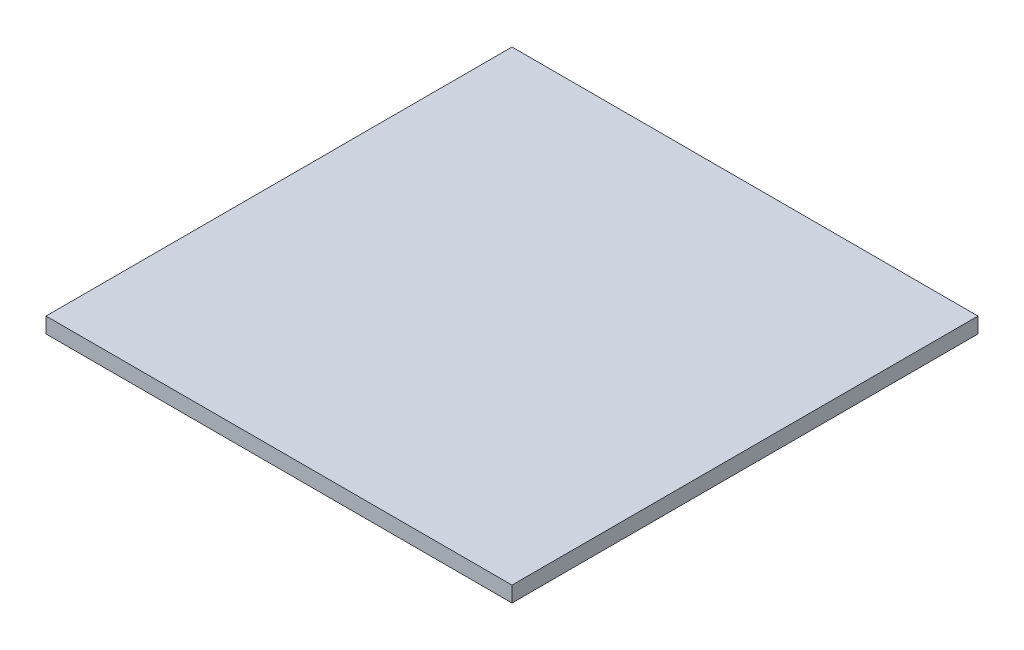
ISO-10303-21;
HEADER;
FILE_DESCRIPTION(('STEP AP214'),'2;1');
FILE_NAME('part.step','',(''),(''),'','','');
FILE_SCHEMA(('AUTOMOTIVE_DESIGN { 1 0 10303 214 1 1 1 1 }'));
ENDSEC;
DATA;
#1=APPLICATION_CONTEXT('core data for automotive mechanical design processes');
#2=APPLICATION_PROTOCOL_DEFINITION('international standard','automotive_design',2000,#1);
#3=PRODUCT_CONTEXT('',#1,'mechanical');
#4=PRODUCT('Part','Part','',(#3));
#5=PRODUCT_RELATED_PRODUCT_CATEGORY('part','',(#4));
#6=PRODUCT_DEFINITION_FORMATION('','',#4);
#7=PRODUCT_DEFINITION_CONTEXT('part definition',#1,'design');
#8=PRODUCT_DEFINITION('design','',#6,#7);
#9=PRODUCT_DEFINITION_SHAPE('','',#8);
#10=(LENGTH_UNIT() NAMED_UNIT(*) SI_UNIT(.MILLI.,.METRE.));
#11=(NAMED_UNIT(*) PLANE_ANGLE_UNIT() SI_UNIT($,.RADIAN.));
#12=(NAMED_UNIT(*) SI_UNIT($,.STERADIAN.) SOLID_ANGLE_UNIT());
#13=UNCERTAINTY_MEASURE_WITH_UNIT(LENGTH_MEASURE(1.E-05),#10,'distance_accuracy_value','');
#14=(GEOMETRIC_REPRESENTATION_CONTEXT(3) GLOBAL_UNCERTAINTY_ASSIGNED_CONTEXT((#13)) GLOBAL_UNIT_ASSIGNED_CONTEXT((#10,
#11,#12)) REPRESENTATION_CONTEXT('',''));
#15=CARTESIAN_POINT('',(0.,0.,0.));
#16=DIRECTION('',(0.,0.,1.));
#17=DIRECTION('',(1.,0.,0.));
#18=AXIS2_PLACEMENT_3D('',#15,#16,#17);
#19=CARTESIAN_POINT('',(0.,25.4,0.));
#20=DIRECTION('',(1.,0.,0.));
#21=DIRECTION('',(0.,0.,-1.));
#22=AXIS2_PLACEMENT_3D('',#19,#20,#21);
#23=PLANE('',#22);
#24=DIRECTION('',(0.,0.,1.));
#25=VECTOR('',#24,1.);
#26=CARTESIAN_POINT('',(0.,0.,0.));
#27=LINE('',#26,#25);
#28=CARTESIAN_POINT('',(0.,0.,-762.));
#29=VERTEX_POINT('',#28);
#30=CARTESIAN_POINT('',(0.,0.,0.));
#31=VERTEX_POINT('',#30);
#32=EDGE_CURVE('E96',#29,#31,#27,.T.);
#33=ORIENTED_EDGE('',*,*,#32,.T.);
#34=DIRECTION('',(0.,-1.,0.));
#35=VECTOR('',#34,1.);
#36=CARTESIAN_POINT('',(0.,25.4,0.));
#37=LINE('',#36,#35);
#38=CARTESIAN_POINT('',(0.,25.4,0.));
#39=VERTEX_POINT('',#38);
#40=EDGE_CURVE('E11',#39,#31,#37,.T.);
#41=ORIENTED_EDGE('',*,*,#40,.F.);
#42=DIRECTION('',(0.,0.,1.));
#43=VECTOR('',#42,1.);
#44=CARTESIAN_POINT('',(0.,25.4,0.));
#45=LINE('',#44,#43);
#46=CARTESIAN_POINT('',(0.,25.4,-762.));
#47=VERTEX_POINT('',#46);
#48=EDGE_CURVE('E84',#47,#39,#45,.T.);
#49=ORIENTED_EDGE('',*,*,#48,.F.);
#50=DIRECTION('',(0.,-1.,0.));
#51=VECTOR('',#50,1.);
#52=CARTESIAN_POINT('',(0.,25.4,-762.));
#53=LINE('',#52,#51);
#54=EDGE_CURVE('E92',#47,#29,#53,.T.);
#55=ORIENTED_EDGE('',*,*,#54,.T.);
#56=EDGE_LOOP('',(#33,#41,#49,#55));
#57=FACE_BOUND('',#56,.T.);
#58=ADVANCED_FACE('F33',(#57),#23,.F.);
#59=CARTESIAN_POINT('',(0.,25.4,0.));
#60=DIRECTION('',(0.,0.,-1.));
#61=DIRECTION('',(-1.,0.,0.));
#62=AXIS2_PLACEMENT_3D('',#59,#60,#61);
#63=PLANE('',#62);
#64=DIRECTION('',(1.,0.,0.));
#65=VECTOR('',#64,1.);
#66=CARTESIAN_POINT('',(0.,0.,0.));
#67=LINE('',#66,#65);
#68=CARTESIAN_POINT('',(762.,0.,0.));
#69=VERTEX_POINT('',#68);
#70=EDGE_CURVE('E88',#31,#69,#67,.T.);
#71=ORIENTED_EDGE('',*,*,#70,.T.);
#72=DIRECTION('',(0.,-1.,0.));
#73=VECTOR('',#72,1.);
#74=CARTESIAN_POINT('',(762.,25.4,0.));
#75=LINE('',#74,#73);
#76=CARTESIAN_POINT('',(762.,25.4,0.));
#77=VERTEX_POINT('',#76);
#78=EDGE_CURVE('E41',#77,#69,#75,.T.);
#79=ORIENTED_EDGE('',*,*,#78,.F.);
#80=DIRECTION('',(1.,0.,0.));
#81=VECTOR('',#80,1.);
#82=CARTESIAN_POINT('',(0.,25.4,0.));
#83=LINE('',#82,#81);
#84=EDGE_CURVE('E79',#39,#77,#83,.T.);
#85=ORIENTED_EDGE('',*,*,#84,.F.);
#86=ORIENTED_EDGE('',*,*,#40,.T.);
#87=EDGE_LOOP('',(#71,#79,#85,#86));
#88=FACE_BOUND('',#87,.T.);
#89=ADVANCED_FACE('F87',(#88),#63,.F.);
#90=CARTESIAN_POINT('',(762.,25.4,0.));
#91=DIRECTION('',(-1.,0.,0.));
#92=DIRECTION('',(0.,0.,1.));
#93=AXIS2_PLACEMENT_3D('',#90,#91,#92);
#94=PLANE('',#93);
#95=DIRECTION('',(0.,0.,-1.));
#96=VECTOR('',#95,1.);
#97=CARTESIAN_POINT('',(762.,0.,0.));
#98=LINE('',#97,#96);
#99=CARTESIAN_POINT('',(762.,0.,-762.));
#100=VERTEX_POINT('',#99);
#101=EDGE_CURVE('E66',#69,#100,#98,.T.);
#102=ORIENTED_EDGE('',*,*,#101,.T.);
#103=DIRECTION('',(0.,-1.,0.));
#104=VECTOR('',#103,1.);
#105=CARTESIAN_POINT('',(762.,25.4,-762.));
#106=LINE('',#105,#104);
#107=CARTESIAN_POINT('',(762.,25.4,-762.));
#108=VERTEX_POINT('',#107);
#109=EDGE_CURVE('E89',#108,#100,#106,.T.);
#110=ORIENTED_EDGE('',*,*,#109,.F.);
#111=DIRECTION('',(0.,0.,-1.));
#112=VECTOR('',#111,1.);
#113=CARTESIAN_POINT('',(762.,25.4,0.));
#114=LINE('',#113,#112);
#115=EDGE_CURVE('E82',#77,#108,#114,.T.);
#116=ORIENTED_EDGE('',*,*,#115,.F.);
#117=ORIENTED_EDGE('',*,*,#78,.T.);
#118=EDGE_LOOP('',(#102,#110,#116,#117));
#119=FACE_BOUND('',#118,.T.);
#120=ADVANCED_FACE('F90',(#119),#94,.F.);
#121=CARTESIAN_POINT('',(0.,25.4,-762.));
#122=DIRECTION('',(0.,0.,1.));
#123=DIRECTION('',(1.,0.,0.));
#124=AXIS2_PLACEMENT_3D('',#121,#122,#123);
#125=PLANE('',#124);
#126=DIRECTION('',(-1.,0.,0.));
#127=VECTOR('',#126,1.);
#128=CARTESIAN_POINT('',(0.,0.,-762.));
#129=LINE('',#128,#127);
#130=EDGE_CURVE('E72',#100,#29,#129,.T.);
#131=ORIENTED_EDGE('',*,*,#130,.T.);
#132=ORIENTED_EDGE('',*,*,#54,.F.);
#133=DIRECTION('',(-1.,0.,0.));
#134=VECTOR('',#133,1.);
#135=CARTESIAN_POINT('',(0.,25.4,-762.));
#136=LINE('',#135,#134);
#137=EDGE_CURVE('E49',#108,#47,#136,.T.);
#138=ORIENTED_EDGE('',*,*,#137,.F.);
#139=ORIENTED_EDGE('',*,*,#109,.T.);
#140=EDGE_LOOP('',(#131,#132,#138,#139));
#141=FACE_BOUND('',#140,.T.);
#142=ADVANCED_FACE('F103',(#141),#125,.F.);
#143=CARTESIAN_POINT('',(0.,25.4,0.));
#144=DIRECTION('',(0.,-1.,0.));
#145=DIRECTION('',(0.,0.,-1.));
#146=AXIS2_PLACEMENT_3D('',#143,#144,#145);
#147=PLANE('',#146);
#148=ORIENTED_EDGE('',*,*,#48,.T.);
#149=ORIENTED_EDGE('',*,*,#84,.T.);
#150=ORIENTED_EDGE('',*,*,#115,.T.);
#151=ORIENTED_EDGE('',*,*,#137,.T.);
#152=EDGE_LOOP('',(#148,#149,#150,#151));
#153=FACE_BOUND('',#152,.T.);
#154=ADVANCED_FACE('F80',(#153),#147,.F.);
#155=CARTESIAN_POINT('',(0.,0.,0.));
#156=DIRECTION('',(0.,-1.,0.));
#157=DIRECTION('',(0.,0.,-1.));
#158=AXIS2_PLACEMENT_3D('',#155,#156,#157);
#159=PLANE('',#158);
#160=ORIENTED_EDGE('',*,*,#32,.F.);
#161=ORIENTED_EDGE('',*,*,#130,.F.);
#162=ORIENTED_EDGE('',*,*,#101,.F.);
#163=ORIENTED_EDGE('',*,*,#70,.F.);
#164=EDGE_LOOP('',(#160,#161,#162,#163));
#165=FACE_BOUND('',#164,.T.);
#166=ADVANCED_FACE('F106',(#165),#159,.T.);
#167=CLOSED_SHELL('',(#58,#89,#120,#142,#154,#166));
#168=MANIFOLD_SOLID_BREP('B2',#167);
#169=ADVANCED_BREP_SHAPE_REPRESENTATION('',(#18,#168),#14);
#170=SHAPE_DEFINITION_REPRESENTATION(#9,#169);
ENDSEC;
END-ISO-10303-21;
